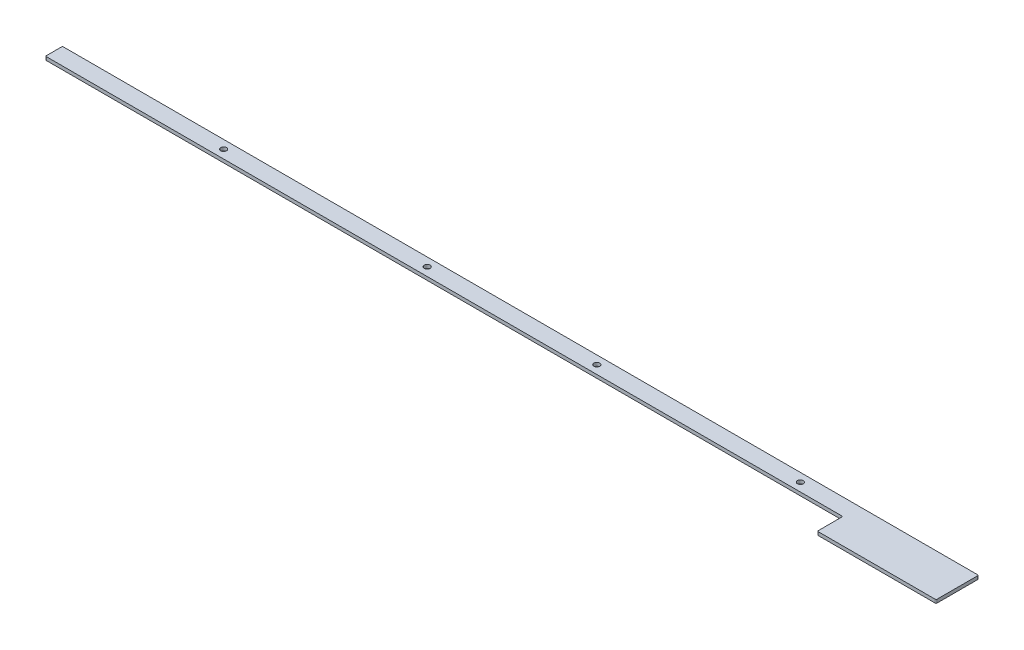
ISO-10303-21;
HEADER;
FILE_DESCRIPTION(('STEP AP214'),'2;1');
FILE_NAME('part.step','',(''),(''),'','','');
FILE_SCHEMA(('AUTOMOTIVE_DESIGN { 1 0 10303 214 1 1 1 1 }'));
ENDSEC;
DATA;
#1=APPLICATION_CONTEXT('core data for automotive mechanical design processes');
#2=APPLICATION_PROTOCOL_DEFINITION('international standard','automotive_design',2000,#1);
#3=PRODUCT_CONTEXT('',#1,'mechanical');
#4=PRODUCT('Part','Part','',(#3));
#5=PRODUCT_RELATED_PRODUCT_CATEGORY('part','',(#4));
#6=PRODUCT_DEFINITION_FORMATION('','',#4);
#7=PRODUCT_DEFINITION_CONTEXT('part definition',#1,'design');
#8=PRODUCT_DEFINITION('design','',#6,#7);
#9=PRODUCT_DEFINITION_SHAPE('','',#8);
#10=(LENGTH_UNIT() NAMED_UNIT(*) SI_UNIT(.MILLI.,.METRE.));
#11=(NAMED_UNIT(*) PLANE_ANGLE_UNIT() SI_UNIT($,.RADIAN.));
#12=(NAMED_UNIT(*) SI_UNIT($,.STERADIAN.) SOLID_ANGLE_UNIT());
#13=UNCERTAINTY_MEASURE_WITH_UNIT(LENGTH_MEASURE(1.E-05),#10,'distance_accuracy_value','');
#14=(GEOMETRIC_REPRESENTATION_CONTEXT(3) GLOBAL_UNCERTAINTY_ASSIGNED_CONTEXT((#13)) GLOBAL_UNIT_ASSIGNED_CONTEXT((#10,
#11,#12)) REPRESENTATION_CONTEXT('',''));
#15=CARTESIAN_POINT('',(0.,0.,0.));
#16=DIRECTION('',(0.,0.,1.));
#17=DIRECTION('',(1.,0.,0.));
#18=AXIS2_PLACEMENT_3D('',#15,#16,#17);
#19=CARTESIAN_POINT('',(-270.,2.,5.00000000000003));
#20=DIRECTION('',(1.,0.,0.));
#21=DIRECTION('',(0.,0.,-1.));
#22=AXIS2_PLACEMENT_3D('',#19,#20,#21);
#23=PLANE('',#22);
#24=DIRECTION('',(0.,0.,1.));
#25=VECTOR('',#24,1.);
#26=CARTESIAN_POINT('',(-270.,0.,5.00000000000003));
#27=LINE('',#26,#25);
#28=CARTESIAN_POINT('',(-270.,0.,-4.49999999999997));
#29=VERTEX_POINT('',#28);
#30=CARTESIAN_POINT('',(-270.,0.,4.50000000000004));
#31=VERTEX_POINT('',#30);
#32=EDGE_CURVE('E152',#29,#31,#27,.T.);
#33=ORIENTED_EDGE('',*,*,#32,.T.);
#34=DIRECTION('',(0.,-1.,0.));
#35=VECTOR('',#34,1.);
#36=CARTESIAN_POINT('',(-270.,2.,4.50000000000004));
#37=LINE('',#36,#35);
#38=CARTESIAN_POINT('',(-270.,2.,4.50000000000004));
#39=VERTEX_POINT('',#38);
#40=EDGE_CURVE('E128',#31,#39,#37,.F.);
#41=ORIENTED_EDGE('',*,*,#40,.T.);
#42=DIRECTION('',(0.,0.,1.));
#43=VECTOR('',#42,1.);
#44=CARTESIAN_POINT('',(-270.,2.,5.00000000000003));
#45=LINE('',#44,#43);
#46=CARTESIAN_POINT('',(-270.,2.,-4.49999999999997));
#47=VERTEX_POINT('',#46);
#48=EDGE_CURVE('E162',#47,#39,#45,.T.);
#49=ORIENTED_EDGE('',*,*,#48,.F.);
#50=DIRECTION('',(0.,-1.,0.));
#51=VECTOR('',#50,1.);
#52=CARTESIAN_POINT('',(-270.,2.,-4.49999999999997));
#53=LINE('',#52,#51);
#54=EDGE_CURVE('E133',#47,#29,#53,.T.);
#55=ORIENTED_EDGE('',*,*,#54,.T.);
#56=EDGE_LOOP('',(#33,#41,#49,#55));
#57=FACE_BOUND('',#56,.T.);
#58=ADVANCED_FACE('F33',(#57),#23,.F.);
#59=CARTESIAN_POINT('',(270.,2.,4.99999999999997));
#60=DIRECTION('',(0.,0.,-1.));
#61=DIRECTION('',(-1.,0.,0.));
#62=AXIS2_PLACEMENT_3D('',#59,#60,#61);
#63=PLANE('',#62);
#64=DIRECTION('',(1.,0.,0.));
#65=VECTOR('',#64,1.);
#66=CARTESIAN_POINT('',(270.,2.,4.99999999999997));
#67=LINE('',#66,#65);
#68=CARTESIAN_POINT('',(-269.5,2.,5.00000000000003));
#69=VERTEX_POINT('',#68);
#70=CARTESIAN_POINT('',(199.5,2.,4.99999999999998));
#71=VERTEX_POINT('',#70);
#72=EDGE_CURVE('E144',#69,#71,#67,.T.);
#73=ORIENTED_EDGE('',*,*,#72,.F.);
#74=DIRECTION('',(0.,-1.,0.));
#75=VECTOR('',#74,1.);
#76=CARTESIAN_POINT('',(-269.5,2.,5.00000000000003));
#77=LINE('',#76,#75);
#78=CARTESIAN_POINT('',(-269.5,0.,5.00000000000003));
#79=VERTEX_POINT('',#78);
#80=EDGE_CURVE('E127',#69,#79,#77,.T.);
#81=ORIENTED_EDGE('',*,*,#80,.T.);
#82=DIRECTION('',(1.,0.,0.));
#83=VECTOR('',#82,1.);
#84=CARTESIAN_POINT('',(270.,0.,4.99999999999997));
#85=LINE('',#84,#83);
#86=CARTESIAN_POINT('',(199.5,0.,4.99999999999998));
#87=VERTEX_POINT('',#86);
#88=EDGE_CURVE('E141',#79,#87,#85,.T.);
#89=ORIENTED_EDGE('',*,*,#88,.T.);
#90=DIRECTION('',(0.,1.,0.));
#91=VECTOR('',#90,1.);
#92=CARTESIAN_POINT('',(199.5,2.,4.99999999999998));
#93=LINE('',#92,#91);
#94=EDGE_CURVE('E146',#87,#71,#93,.T.);
#95=ORIENTED_EDGE('',*,*,#94,.T.);
#96=EDGE_LOOP('',(#73,#81,#89,#95));
#97=FACE_BOUND('',#96,.T.);
#98=ADVANCED_FACE('F139',(#97),#63,.F.);
#99=CARTESIAN_POINT('',(270.,2.,4.99999999999997));
#100=DIRECTION('',(-1.,0.,0.));
#101=DIRECTION('',(0.,0.,1.));
#102=AXIS2_PLACEMENT_3D('',#99,#100,#101);
#103=PLANE('',#102);
#104=DIRECTION('',(0.,0.,-1.));
#105=VECTOR('',#104,1.);
#106=CARTESIAN_POINT('',(270.,2.,4.99999999999997));
#107=LINE('',#106,#105);
#108=CARTESIAN_POINT('',(270.,2.,19.5));
#109=VERTEX_POINT('',#108);
#110=CARTESIAN_POINT('',(270.,2.,-4.50000000000003));
#111=VERTEX_POINT('',#110);
#112=EDGE_CURVE('E305',#109,#111,#107,.T.);
#113=ORIENTED_EDGE('',*,*,#112,.F.);
#114=DIRECTION('',(0.,1.,0.));
#115=VECTOR('',#114,1.);
#116=CARTESIAN_POINT('',(270.,0.,19.5));
#117=LINE('',#116,#115);
#118=CARTESIAN_POINT('',(270.,0.,19.5));
#119=VERTEX_POINT('',#118);
#120=EDGE_CURVE('E204',#109,#119,#117,.F.);
#121=ORIENTED_EDGE('',*,*,#120,.T.);
#122=DIRECTION('',(0.,0.,-1.));
#123=VECTOR('',#122,1.);
#124=CARTESIAN_POINT('',(270.,0.,4.99999999999997));
#125=LINE('',#124,#123);
#126=CARTESIAN_POINT('',(270.,0.,-4.50000000000003));
#127=VERTEX_POINT('',#126);
#128=EDGE_CURVE('E151',#119,#127,#125,.T.);
#129=ORIENTED_EDGE('',*,*,#128,.T.);
#130=DIRECTION('',(0.,-1.,0.));
#131=VECTOR('',#130,1.);
#132=CARTESIAN_POINT('',(270.,2.,-4.50000000000003));
#133=LINE('',#132,#131);
#134=EDGE_CURVE('E202',#127,#111,#133,.F.);
#135=ORIENTED_EDGE('',*,*,#134,.T.);
#136=EDGE_LOOP('',(#113,#121,#129,#135));
#137=FACE_BOUND('',#136,.T.);
#138=ADVANCED_FACE('F241',(#137),#103,.F.);
#139=CARTESIAN_POINT('',(270.,2.,-5.00000000000003));
#140=DIRECTION('',(0.,0.,1.));
#141=DIRECTION('',(1.,0.,0.));
#142=AXIS2_PLACEMENT_3D('',#139,#140,#141);
#143=PLANE('',#142);
#144=DIRECTION('',(-1.,0.,0.));
#145=VECTOR('',#144,1.);
#146=CARTESIAN_POINT('',(270.,2.,-5.00000000000003));
#147=LINE('',#146,#145);
#148=CARTESIAN_POINT('',(269.5,2.,-5.00000000000003));
#149=VERTEX_POINT('',#148);
#150=CARTESIAN_POINT('',(-269.5,2.,-4.99999999999997));
#151=VERTEX_POINT('',#150);
#152=EDGE_CURVE('E172',#149,#151,#147,.T.);
#153=ORIENTED_EDGE('',*,*,#152,.F.);
#154=DIRECTION('',(0.,-1.,0.));
#155=VECTOR('',#154,1.);
#156=CARTESIAN_POINT('',(269.5,2.,-5.00000000000003));
#157=LINE('',#156,#155);
#158=CARTESIAN_POINT('',(269.5,0.,-5.00000000000003));
#159=VERTEX_POINT('',#158);
#160=EDGE_CURVE('E207',#149,#159,#157,.T.);
#161=ORIENTED_EDGE('',*,*,#160,.T.);
#162=DIRECTION('',(-1.,0.,0.));
#163=VECTOR('',#162,1.);
#164=CARTESIAN_POINT('',(270.,0.,-5.00000000000003));
#165=LINE('',#164,#163);
#166=CARTESIAN_POINT('',(-269.5,0.,-4.99999999999997));
#167=VERTEX_POINT('',#166);
#168=EDGE_CURVE('E155',#159,#167,#165,.T.);
#169=ORIENTED_EDGE('',*,*,#168,.T.);
#170=DIRECTION('',(0.,-1.,0.));
#171=VECTOR('',#170,1.);
#172=CARTESIAN_POINT('',(-269.5,2.,-4.99999999999997));
#173=LINE('',#172,#171);
#174=EDGE_CURVE('E48',#167,#151,#173,.F.);
#175=ORIENTED_EDGE('',*,*,#174,.T.);
#176=EDGE_LOOP('',(#153,#161,#169,#175));
#177=FACE_BOUND('',#176,.T.);
#178=ADVANCED_FACE('F246',(#177),#143,.F.);
#179=CARTESIAN_POINT('',(0.,2.,0.));
#180=DIRECTION('',(0.,1.,0.));
#181=DIRECTION('',(0.,0.,1.));
#182=AXIS2_PLACEMENT_3D('',#179,#180,#181);
#183=PLANE('',#182);
#184=CARTESIAN_POINT('',(-170.,2.,0.));
#185=DIRECTION('',(0.,1.,0.));
#186=DIRECTION('',(0.,0.,1.));
#187=AXIS2_PLACEMENT_3D('',#184,#185,#186);
#188=CIRCLE('',#187,1.70000000000001);
#189=CARTESIAN_POINT('',(-170.,2.,1.70000000000001));
#190=VERTEX_POINT('',#189);
#191=EDGE_CURVE('E280',#190,#190,#188,.T.);
#192=ORIENTED_EDGE('',*,*,#191,.F.);
#193=EDGE_LOOP('',(#192));
#194=FACE_BOUND('',#193,.T.);
#195=CARTESIAN_POINT('',(-50.,2.,0.));
#196=DIRECTION('',(0.,1.,0.));
#197=DIRECTION('',(0.,0.,1.));
#198=AXIS2_PLACEMENT_3D('',#195,#196,#197);
#199=CIRCLE('',#198,1.7);
#200=CARTESIAN_POINT('',(-50.,2.,1.7));
#201=VERTEX_POINT('',#200);
#202=EDGE_CURVE('E284',#201,#201,#199,.T.);
#203=ORIENTED_EDGE('',*,*,#202,.F.);
#204=EDGE_LOOP('',(#203));
#205=FACE_BOUND('',#204,.T.);
#206=CARTESIAN_POINT('',(50.,2.,0.));
#207=DIRECTION('',(0.,1.,0.));
#208=DIRECTION('',(0.,0.,1.));
#209=AXIS2_PLACEMENT_3D('',#206,#207,#208);
#210=CIRCLE('',#209,1.7);
#211=CARTESIAN_POINT('',(50.,2.,1.7));
#212=VERTEX_POINT('',#211);
#213=EDGE_CURVE('E171',#212,#212,#210,.T.);
#214=ORIENTED_EDGE('',*,*,#213,.F.);
#215=EDGE_LOOP('',(#214));
#216=FACE_BOUND('',#215,.T.);
#217=CARTESIAN_POINT('',(170.,2.,0.));
#218=DIRECTION('',(0.,1.,0.));
#219=DIRECTION('',(0.,0.,1.));
#220=AXIS2_PLACEMENT_3D('',#217,#218,#219);
#221=CIRCLE('',#220,1.70000000000001);
#222=CARTESIAN_POINT('',(170.,2.,1.70000000000001));
#223=VERTEX_POINT('',#222);
#224=EDGE_CURVE('E167',#223,#223,#221,.T.);
#225=ORIENTED_EDGE('',*,*,#224,.F.);
#226=EDGE_LOOP('',(#225));
#227=FACE_BOUND('',#226,.T.);
#228=ORIENTED_EDGE('',*,*,#48,.T.);
#229=CARTESIAN_POINT('',(-269.5,2.,4.50000000000004));
#230=DIRECTION('',(0.,1.,0.));
#231=DIRECTION('',(0.,0.,1.));
#232=AXIS2_PLACEMENT_3D('',#229,#230,#231);
#233=CIRCLE('',#232,0.5);
#234=EDGE_CURVE('E190',#39,#69,#233,.T.);
#235=ORIENTED_EDGE('',*,*,#234,.T.);
#236=ORIENTED_EDGE('',*,*,#72,.T.);
#237=CARTESIAN_POINT('',(199.5,2.,5.49999999999998));
#238=DIRECTION('',(0.,1.,0.));
#239=DIRECTION('',(0.,0.,1.));
#240=AXIS2_PLACEMENT_3D('',#237,#238,#239);
#241=CIRCLE('',#240,0.5);
#242=CARTESIAN_POINT('',(200.,2.,5.49999999999998));
#243=VERTEX_POINT('',#242);
#244=EDGE_CURVE('E41',#71,#243,#241,.F.);
#245=ORIENTED_EDGE('',*,*,#244,.T.);
#246=DIRECTION('',(0.,0.,1.));
#247=VECTOR('',#246,1.);
#248=CARTESIAN_POINT('',(200.,2.,4.99999999999998));
#249=LINE('',#248,#247);
#250=CARTESIAN_POINT('',(200.,2.,19.5));
#251=VERTEX_POINT('',#250);
#252=EDGE_CURVE('E166',#243,#251,#249,.T.);
#253=ORIENTED_EDGE('',*,*,#252,.T.);
#254=CARTESIAN_POINT('',(200.5,2.,19.5));
#255=DIRECTION('',(0.,1.,0.));
#256=DIRECTION('',(0.,0.,1.));
#257=AXIS2_PLACEMENT_3D('',#254,#255,#256);
#258=CIRCLE('',#257,0.5);
#259=CARTESIAN_POINT('',(200.5,2.,20.));
#260=VERTEX_POINT('',#259);
#261=EDGE_CURVE('E183',#251,#260,#258,.T.);
#262=ORIENTED_EDGE('',*,*,#261,.T.);
#263=DIRECTION('',(1.,0.,0.));
#264=VECTOR('',#263,1.);
#265=CARTESIAN_POINT('',(270.,2.,20.));
#266=LINE('',#265,#264);
#267=CARTESIAN_POINT('',(269.5,2.,20.));
#268=VERTEX_POINT('',#267);
#269=EDGE_CURVE('E219',#260,#268,#266,.T.);
#270=ORIENTED_EDGE('',*,*,#269,.T.);
#271=CARTESIAN_POINT('',(269.5,2.,19.5));
#272=DIRECTION('',(0.,1.,0.));
#273=DIRECTION('',(0.,0.,1.));
#274=AXIS2_PLACEMENT_3D('',#271,#272,#273);
#275=CIRCLE('',#274,0.5);
#276=EDGE_CURVE('E188',#268,#109,#275,.T.);
#277=ORIENTED_EDGE('',*,*,#276,.T.);
#278=ORIENTED_EDGE('',*,*,#112,.T.);
#279=CARTESIAN_POINT('',(269.5,2.,-4.50000000000003));
#280=DIRECTION('',(0.,1.,0.));
#281=DIRECTION('',(0.,0.,1.));
#282=AXIS2_PLACEMENT_3D('',#279,#280,#281);
#283=CIRCLE('',#282,0.5);
#284=EDGE_CURVE('E55',#111,#149,#283,.T.);
#285=ORIENTED_EDGE('',*,*,#284,.T.);
#286=ORIENTED_EDGE('',*,*,#152,.T.);
#287=CARTESIAN_POINT('',(-269.5,2.,-4.49999999999997));
#288=DIRECTION('',(0.,1.,0.));
#289=DIRECTION('',(0.,0.,1.));
#290=AXIS2_PLACEMENT_3D('',#287,#288,#289);
#291=CIRCLE('',#290,0.5);
#292=EDGE_CURVE('E185',#151,#47,#291,.T.);
#293=ORIENTED_EDGE('',*,*,#292,.T.);
#294=EDGE_LOOP('',(#228,#235,#236,#245,#253,#262,#270,#277,#278,#285,#286,#293));
#295=FACE_BOUND('',#294,.T.);
#296=ADVANCED_FACE('F212',(#194,#205,#216,#227,#295),#183,.T.);
#297=CARTESIAN_POINT('',(0.,0.,0.));
#298=DIRECTION('',(0.,1.,0.));
#299=DIRECTION('',(0.,0.,1.));
#300=AXIS2_PLACEMENT_3D('',#297,#298,#299);
#301=PLANE('',#300);
#302=CARTESIAN_POINT('',(-170.,0.,0.));
#303=DIRECTION('',(0.,1.,0.));
#304=DIRECTION('',(0.,0.,1.));
#305=AXIS2_PLACEMENT_3D('',#302,#303,#304);
#306=CIRCLE('',#305,1.70000000000001);
#307=CARTESIAN_POINT('',(-170.,0.,1.70000000000001));
#308=VERTEX_POINT('',#307);
#309=EDGE_CURVE('E283',#308,#308,#306,.T.);
#310=ORIENTED_EDGE('',*,*,#309,.T.);
#311=EDGE_LOOP('',(#310));
#312=FACE_BOUND('',#311,.T.);
#313=CARTESIAN_POINT('',(-50.,0.,0.));
#314=DIRECTION('',(0.,1.,0.));
#315=DIRECTION('',(0.,0.,1.));
#316=AXIS2_PLACEMENT_3D('',#313,#314,#315);
#317=CIRCLE('',#316,1.7);
#318=CARTESIAN_POINT('',(-50.,0.,1.7));
#319=VERTEX_POINT('',#318);
#320=EDGE_CURVE('E287',#319,#319,#317,.T.);
#321=ORIENTED_EDGE('',*,*,#320,.T.);
#322=EDGE_LOOP('',(#321));
#323=FACE_BOUND('',#322,.T.);
#324=CARTESIAN_POINT('',(50.,0.,0.));
#325=DIRECTION('',(0.,1.,0.));
#326=DIRECTION('',(0.,0.,1.));
#327=AXIS2_PLACEMENT_3D('',#324,#325,#326);
#328=CIRCLE('',#327,1.7);
#329=CARTESIAN_POINT('',(50.,0.,1.7));
#330=VERTEX_POINT('',#329);
#331=EDGE_CURVE('E168',#330,#330,#328,.T.);
#332=ORIENTED_EDGE('',*,*,#331,.T.);
#333=EDGE_LOOP('',(#332));
#334=FACE_BOUND('',#333,.T.);
#335=CARTESIAN_POINT('',(170.,0.,0.));
#336=DIRECTION('',(0.,1.,0.));
#337=DIRECTION('',(0.,0.,1.));
#338=AXIS2_PLACEMENT_3D('',#335,#336,#337);
#339=CIRCLE('',#338,1.70000000000001);
#340=CARTESIAN_POINT('',(170.,0.,1.70000000000001));
#341=VERTEX_POINT('',#340);
#342=EDGE_CURVE('E163',#341,#341,#339,.T.);
#343=ORIENTED_EDGE('',*,*,#342,.T.);
#344=EDGE_LOOP('',(#343));
#345=FACE_BOUND('',#344,.T.);
#346=ORIENTED_EDGE('',*,*,#88,.F.);
#347=CARTESIAN_POINT('',(-269.5,0.,4.50000000000004));
#348=DIRECTION('',(0.,1.,0.));
#349=DIRECTION('',(0.,0.,1.));
#350=AXIS2_PLACEMENT_3D('',#347,#348,#349);
#351=CIRCLE('',#350,0.5);
#352=EDGE_CURVE('E123',#79,#31,#351,.F.);
#353=ORIENTED_EDGE('',*,*,#352,.T.);
#354=ORIENTED_EDGE('',*,*,#32,.F.);
#355=CARTESIAN_POINT('',(-269.5,0.,-4.49999999999997));
#356=DIRECTION('',(0.,1.,0.));
#357=DIRECTION('',(0.,0.,1.));
#358=AXIS2_PLACEMENT_3D('',#355,#356,#357);
#359=CIRCLE('',#358,0.5);
#360=EDGE_CURVE('E175',#29,#167,#359,.F.);
#361=ORIENTED_EDGE('',*,*,#360,.T.);
#362=ORIENTED_EDGE('',*,*,#168,.F.);
#363=CARTESIAN_POINT('',(269.5,0.,-4.50000000000003));
#364=DIRECTION('',(0.,1.,0.));
#365=DIRECTION('',(0.,0.,1.));
#366=AXIS2_PLACEMENT_3D('',#363,#364,#365);
#367=CIRCLE('',#366,0.5);
#368=EDGE_CURVE('E177',#159,#127,#367,.F.);
#369=ORIENTED_EDGE('',*,*,#368,.T.);
#370=ORIENTED_EDGE('',*,*,#128,.F.);
#371=CARTESIAN_POINT('',(269.5,0.,19.5));
#372=DIRECTION('',(0.,1.,0.));
#373=DIRECTION('',(0.,0.,1.));
#374=AXIS2_PLACEMENT_3D('',#371,#372,#373);
#375=CIRCLE('',#374,0.5);
#376=CARTESIAN_POINT('',(269.5,0.,20.));
#377=VERTEX_POINT('',#376);
#378=EDGE_CURVE('E134',#119,#377,#375,.F.);
#379=ORIENTED_EDGE('',*,*,#378,.T.);
#380=DIRECTION('',(1.,0.,0.));
#381=VECTOR('',#380,1.);
#382=CARTESIAN_POINT('',(270.,0.,20.));
#383=LINE('',#382,#381);
#384=CARTESIAN_POINT('',(200.5,0.,20.));
#385=VERTEX_POINT('',#384);
#386=EDGE_CURVE('E157',#385,#377,#383,.T.);
#387=ORIENTED_EDGE('',*,*,#386,.F.);
#388=CARTESIAN_POINT('',(200.5,0.,19.5));
#389=DIRECTION('',(0.,1.,0.));
#390=DIRECTION('',(0.,0.,1.));
#391=AXIS2_PLACEMENT_3D('',#388,#389,#390);
#392=CIRCLE('',#391,0.5);
#393=CARTESIAN_POINT('',(200.,0.,19.5));
#394=VERTEX_POINT('',#393);
#395=EDGE_CURVE('E145',#385,#394,#392,.F.);
#396=ORIENTED_EDGE('',*,*,#395,.T.);
#397=DIRECTION('',(0.,0.,1.));
#398=VECTOR('',#397,1.);
#399=CARTESIAN_POINT('',(200.,0.,4.99999999999998));
#400=LINE('',#399,#398);
#401=CARTESIAN_POINT('',(200.,0.,5.49999999999998));
#402=VERTEX_POINT('',#401);
#403=EDGE_CURVE('E297',#402,#394,#400,.T.);
#404=ORIENTED_EDGE('',*,*,#403,.F.);
#405=CARTESIAN_POINT('',(199.5,0.,5.49999999999998));
#406=DIRECTION('',(0.,1.,0.));
#407=DIRECTION('',(0.,0.,1.));
#408=AXIS2_PLACEMENT_3D('',#405,#406,#407);
#409=CIRCLE('',#408,0.5);
#410=EDGE_CURVE('E11',#402,#87,#409,.T.);
#411=ORIENTED_EDGE('',*,*,#410,.T.);
#412=EDGE_LOOP('',(#346,#353,#354,#361,#362,#369,#370,#379,#387,#396,#404,#411));
#413=FACE_BOUND('',#412,.T.);
#414=ADVANCED_FACE('F148',(#312,#323,#334,#345,#413),#301,.F.);
#415=CARTESIAN_POINT('',(270.,0.,20.));
#416=DIRECTION('',(0.,0.,1.));
#417=DIRECTION('',(1.,0.,0.));
#418=AXIS2_PLACEMENT_3D('',#415,#416,#417);
#419=PLANE('',#418);
#420=ORIENTED_EDGE('',*,*,#386,.T.);
#421=DIRECTION('',(0.,1.,0.));
#422=VECTOR('',#421,1.);
#423=CARTESIAN_POINT('',(269.5,2.,20.));
#424=LINE('',#423,#422);
#425=EDGE_CURVE('E199',#377,#268,#424,.T.);
#426=ORIENTED_EDGE('',*,*,#425,.T.);
#427=ORIENTED_EDGE('',*,*,#269,.F.);
#428=DIRECTION('',(0.,1.,0.));
#429=VECTOR('',#428,1.);
#430=CARTESIAN_POINT('',(200.5,0.,20.));
#431=LINE('',#430,#429);
#432=EDGE_CURVE('E197',#260,#385,#431,.F.);
#433=ORIENTED_EDGE('',*,*,#432,.T.);
#434=EDGE_LOOP('',(#420,#426,#427,#433));
#435=FACE_BOUND('',#434,.T.);
#436=ADVANCED_FACE('F252',(#435),#419,.T.);
#437=CARTESIAN_POINT('',(200.,0.,4.99999999999998));
#438=DIRECTION('',(-1.,0.,0.));
#439=DIRECTION('',(0.,0.,1.));
#440=AXIS2_PLACEMENT_3D('',#437,#438,#439);
#441=PLANE('',#440);
#442=ORIENTED_EDGE('',*,*,#252,.F.);
#443=DIRECTION('',(0.,1.,0.));
#444=VECTOR('',#443,1.);
#445=CARTESIAN_POINT('',(200.,0.,5.49999999999998));
#446=LINE('',#445,#444);
#447=EDGE_CURVE('E195',#243,#402,#446,.F.);
#448=ORIENTED_EDGE('',*,*,#447,.T.);
#449=ORIENTED_EDGE('',*,*,#403,.T.);
#450=DIRECTION('',(0.,1.,0.));
#451=VECTOR('',#450,1.);
#452=CARTESIAN_POINT('',(200.,0.,19.5));
#453=LINE('',#452,#451);
#454=EDGE_CURVE('E192',#394,#251,#453,.T.);
#455=ORIENTED_EDGE('',*,*,#454,.T.);
#456=EDGE_LOOP('',(#442,#448,#449,#455));
#457=FACE_BOUND('',#456,.T.);
#458=ADVANCED_FACE('F216',(#457),#441,.T.);
#459=CARTESIAN_POINT('',(170.,2.,0.));
#460=DIRECTION('',(0.,1.,0.));
#461=DIRECTION('',(0.,0.,1.));
#462=AXIS2_PLACEMENT_3D('',#459,#460,#461);
#463=CYLINDRICAL_SURFACE('',#462,1.70000000000001);
#464=ORIENTED_EDGE('',*,*,#224,.T.);
#465=EDGE_LOOP('',(#464));
#466=FACE_BOUND('',#465,.T.);
#467=ORIENTED_EDGE('',*,*,#342,.F.);
#468=EDGE_LOOP('',(#467));
#469=FACE_BOUND('',#468,.T.);
#470=ADVANCED_FACE('F259',(#466,#469),#463,.F.);
#471=CARTESIAN_POINT('',(50.,2.,0.));
#472=DIRECTION('',(0.,1.,0.));
#473=DIRECTION('',(0.,0.,1.));
#474=AXIS2_PLACEMENT_3D('',#471,#472,#473);
#475=CYLINDRICAL_SURFACE('',#474,1.7);
#476=ORIENTED_EDGE('',*,*,#213,.T.);
#477=EDGE_LOOP('',(#476));
#478=FACE_BOUND('',#477,.T.);
#479=ORIENTED_EDGE('',*,*,#331,.F.);
#480=EDGE_LOOP('',(#479));
#481=FACE_BOUND('',#480,.T.);
#482=ADVANCED_FACE('F265',(#478,#481),#475,.F.);
#483=CARTESIAN_POINT('',(-50.,2.,0.));
#484=DIRECTION('',(0.,1.,0.));
#485=DIRECTION('',(0.,0.,1.));
#486=AXIS2_PLACEMENT_3D('',#483,#484,#485);
#487=CYLINDRICAL_SURFACE('',#486,1.7);
#488=ORIENTED_EDGE('',*,*,#202,.T.);
#489=EDGE_LOOP('',(#488));
#490=FACE_BOUND('',#489,.T.);
#491=ORIENTED_EDGE('',*,*,#320,.F.);
#492=EDGE_LOOP('',(#491));
#493=FACE_BOUND('',#492,.T.);
#494=ADVANCED_FACE('F269',(#490,#493),#487,.F.);
#495=CARTESIAN_POINT('',(-170.,2.,0.));
#496=DIRECTION('',(0.,1.,0.));
#497=DIRECTION('',(0.,0.,1.));
#498=AXIS2_PLACEMENT_3D('',#495,#496,#497);
#499=CYLINDRICAL_SURFACE('',#498,1.70000000000001);
#500=ORIENTED_EDGE('',*,*,#191,.T.);
#501=EDGE_LOOP('',(#500));
#502=FACE_BOUND('',#501,.T.);
#503=ORIENTED_EDGE('',*,*,#309,.F.);
#504=EDGE_LOOP('',(#503));
#505=FACE_BOUND('',#504,.T.);
#506=ADVANCED_FACE('F232',(#502,#505),#499,.F.);
#507=CARTESIAN_POINT('',(-269.5,2.,4.50000000000004));
#508=DIRECTION('',(0.,-1.,0.));
#509=DIRECTION('',(0.,0.,-1.));
#510=AXIS2_PLACEMENT_3D('',#507,#508,#509);
#511=CYLINDRICAL_SURFACE('',#510,0.5);
#512=ORIENTED_EDGE('',*,*,#234,.F.);
#513=ORIENTED_EDGE('',*,*,#40,.F.);
#514=ORIENTED_EDGE('',*,*,#352,.F.);
#515=ORIENTED_EDGE('',*,*,#80,.F.);
#516=EDGE_LOOP('',(#512,#513,#514,#515));
#517=FACE_BOUND('',#516,.T.);
#518=ADVANCED_FACE('F126',(#517),#511,.T.);
#519=CARTESIAN_POINT('',(199.5,2.,5.49999999999998));
#520=DIRECTION('',(0.,1.,0.));
#521=DIRECTION('',(0.,0.,1.));
#522=AXIS2_PLACEMENT_3D('',#519,#520,#521);
#523=CYLINDRICAL_SURFACE('',#522,0.5);
#524=ORIENTED_EDGE('',*,*,#410,.F.);
#525=ORIENTED_EDGE('',*,*,#447,.F.);
#526=ORIENTED_EDGE('',*,*,#244,.F.);
#527=ORIENTED_EDGE('',*,*,#94,.F.);
#528=EDGE_LOOP('',(#524,#525,#526,#527));
#529=FACE_BOUND('',#528,.T.);
#530=ADVANCED_FACE('F221',(#529),#523,.F.);
#531=CARTESIAN_POINT('',(269.5,0.,19.5));
#532=DIRECTION('',(0.,-1.,0.));
#533=DIRECTION('',(0.,0.,-1.));
#534=AXIS2_PLACEMENT_3D('',#531,#532,#533);
#535=CYLINDRICAL_SURFACE('',#534,0.5);
#536=ORIENTED_EDGE('',*,*,#378,.F.);
#537=ORIENTED_EDGE('',*,*,#120,.F.);
#538=ORIENTED_EDGE('',*,*,#276,.F.);
#539=ORIENTED_EDGE('',*,*,#425,.F.);
#540=EDGE_LOOP('',(#536,#537,#538,#539));
#541=FACE_BOUND('',#540,.T.);
#542=ADVANCED_FACE('F223',(#541),#535,.T.);
#543=CARTESIAN_POINT('',(269.5,2.,-4.50000000000003));
#544=DIRECTION('',(0.,-1.,0.));
#545=DIRECTION('',(0.,0.,-1.));
#546=AXIS2_PLACEMENT_3D('',#543,#544,#545);
#547=CYLINDRICAL_SURFACE('',#546,0.5);
#548=ORIENTED_EDGE('',*,*,#284,.F.);
#549=ORIENTED_EDGE('',*,*,#134,.F.);
#550=ORIENTED_EDGE('',*,*,#368,.F.);
#551=ORIENTED_EDGE('',*,*,#160,.F.);
#552=EDGE_LOOP('',(#548,#549,#550,#551));
#553=FACE_BOUND('',#552,.T.);
#554=ADVANCED_FACE('F229',(#553),#547,.T.);
#555=CARTESIAN_POINT('',(-269.5,2.,-4.49999999999997));
#556=DIRECTION('',(0.,-1.,0.));
#557=DIRECTION('',(0.,0.,-1.));
#558=AXIS2_PLACEMENT_3D('',#555,#556,#557);
#559=CYLINDRICAL_SURFACE('',#558,0.5);
#560=ORIENTED_EDGE('',*,*,#292,.F.);
#561=ORIENTED_EDGE('',*,*,#174,.F.);
#562=ORIENTED_EDGE('',*,*,#360,.F.);
#563=ORIENTED_EDGE('',*,*,#54,.F.);
#564=EDGE_LOOP('',(#560,#561,#562,#563));
#565=FACE_BOUND('',#564,.T.);
#566=ADVANCED_FACE('F311',(#565),#559,.T.);
#567=CARTESIAN_POINT('',(200.5,0.,19.5));
#568=DIRECTION('',(0.,1.,0.));
#569=DIRECTION('',(0.,0.,1.));
#570=AXIS2_PLACEMENT_3D('',#567,#568,#569);
#571=CYLINDRICAL_SURFACE('',#570,0.5);
#572=ORIENTED_EDGE('',*,*,#395,.F.);
#573=ORIENTED_EDGE('',*,*,#432,.F.);
#574=ORIENTED_EDGE('',*,*,#261,.F.);
#575=ORIENTED_EDGE('',*,*,#454,.F.);
#576=EDGE_LOOP('',(#572,#573,#574,#575));
#577=FACE_BOUND('',#576,.T.);
#578=ADVANCED_FACE('F35',(#577),#571,.T.);
#579=CLOSED_SHELL('',(#58,#98,#138,#178,#296,#414,#436,#458,#470,#482,#494,#506,#518,#530,#542,
#554,#566,#578));
#580=MANIFOLD_SOLID_BREP('B2',#579);
#581=ADVANCED_BREP_SHAPE_REPRESENTATION('',(#18,#580),#14);
#582=SHAPE_DEFINITION_REPRESENTATION(#9,#581);
ENDSEC;
END-ISO-10303-21;
